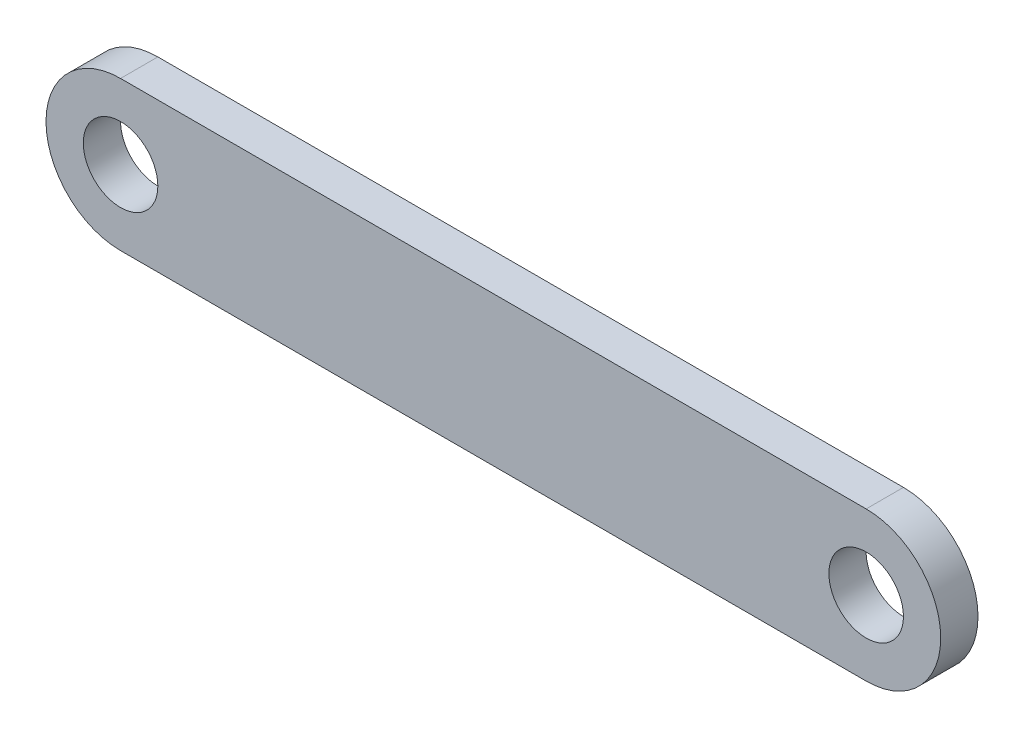
ISO-10303-21;
HEADER;
FILE_DESCRIPTION(('STEP AP214'),'2;1');
FILE_NAME('part.step','',(''),(''),'','','');
FILE_SCHEMA(('AUTOMOTIVE_DESIGN { 1 0 10303 214 1 1 1 1 }'));
ENDSEC;
DATA;
#1=APPLICATION_CONTEXT('core data for automotive mechanical design processes');
#2=APPLICATION_PROTOCOL_DEFINITION('international standard','automotive_design',2000,#1);
#3=PRODUCT_CONTEXT('',#1,'mechanical');
#4=PRODUCT('Part','Part','',(#3));
#5=PRODUCT_RELATED_PRODUCT_CATEGORY('part','',(#4));
#6=PRODUCT_DEFINITION_FORMATION('','',#4);
#7=PRODUCT_DEFINITION_CONTEXT('part definition',#1,'design');
#8=PRODUCT_DEFINITION('design','',#6,#7);
#9=PRODUCT_DEFINITION_SHAPE('','',#8);
#10=(LENGTH_UNIT() NAMED_UNIT(*) SI_UNIT(.MILLI.,.METRE.));
#11=(NAMED_UNIT(*) PLANE_ANGLE_UNIT() SI_UNIT($,.RADIAN.));
#12=(NAMED_UNIT(*) SI_UNIT($,.STERADIAN.) SOLID_ANGLE_UNIT());
#13=UNCERTAINTY_MEASURE_WITH_UNIT(LENGTH_MEASURE(1.E-05),#10,'distance_accuracy_value','');
#14=(GEOMETRIC_REPRESENTATION_CONTEXT(3) GLOBAL_UNCERTAINTY_ASSIGNED_CONTEXT((#13)) GLOBAL_UNIT_ASSIGNED_CONTEXT((#10,
#11,#12)) REPRESENTATION_CONTEXT('',''));
#15=CARTESIAN_POINT('',(0.,0.,0.));
#16=DIRECTION('',(0.,0.,1.));
#17=DIRECTION('',(1.,0.,0.));
#18=AXIS2_PLACEMENT_3D('',#15,#16,#17);
#19=CARTESIAN_POINT('',(50.,0.,5.));
#20=DIRECTION('',(0.,0.,1.));
#21=DIRECTION('',(1.,0.,0.));
#22=AXIS2_PLACEMENT_3D('',#19,#20,#21);
#23=PLANE('',#22);
#24=CARTESIAN_POINT('',(-50.,0.,5.));
#25=DIRECTION('',(0.,0.,1.));
#26=DIRECTION('',(1.,0.,0.));
#27=AXIS2_PLACEMENT_3D('',#24,#25,#26);
#28=CIRCLE('',#27,5.);
#29=CARTESIAN_POINT('',(-45.,0.,5.));
#30=VERTEX_POINT('',#29);
#31=EDGE_CURVE('E100',#30,#30,#28,.T.);
#32=ORIENTED_EDGE('',*,*,#31,.F.);
#33=EDGE_LOOP('',(#32));
#34=FACE_BOUND('',#33,.T.);
#35=CARTESIAN_POINT('',(50.,0.,5.));
#36=DIRECTION('',(0.,0.,1.));
#37=DIRECTION('',(1.,0.,0.));
#38=AXIS2_PLACEMENT_3D('',#35,#36,#37);
#39=CIRCLE('',#38,10.);
#40=CARTESIAN_POINT('',(50.,-9.99999999999997,5.));
#41=VERTEX_POINT('',#40);
#42=CARTESIAN_POINT('',(50.,10.,5.));
#43=VERTEX_POINT('',#42);
#44=EDGE_CURVE('E85',#41,#43,#39,.T.);
#45=ORIENTED_EDGE('',*,*,#44,.T.);
#46=DIRECTION('',(-1.,0.,0.));
#47=VECTOR('',#46,1.);
#48=CARTESIAN_POINT('',(50.,10.,5.));
#49=LINE('',#48,#47);
#50=CARTESIAN_POINT('',(-50.,10.,5.));
#51=VERTEX_POINT('',#50);
#52=EDGE_CURVE('E80',#43,#51,#49,.T.);
#53=ORIENTED_EDGE('',*,*,#52,.T.);
#54=CARTESIAN_POINT('',(-50.,0.,5.));
#55=DIRECTION('',(0.,0.,1.));
#56=DIRECTION('',(1.,0.,0.));
#57=AXIS2_PLACEMENT_3D('',#54,#55,#56);
#58=CIRCLE('',#57,10.);
#59=CARTESIAN_POINT('',(-50.,-9.99999999999998,5.));
#60=VERTEX_POINT('',#59);
#61=EDGE_CURVE('E83',#51,#60,#58,.T.);
#62=ORIENTED_EDGE('',*,*,#61,.T.);
#63=DIRECTION('',(1.,0.,0.));
#64=VECTOR('',#63,1.);
#65=CARTESIAN_POINT('',(50.,-9.99999999999997,5.));
#66=LINE('',#65,#64);
#67=EDGE_CURVE('E50',#60,#41,#66,.T.);
#68=ORIENTED_EDGE('',*,*,#67,.T.);
#69=EDGE_LOOP('',(#45,#53,#62,#68));
#70=FACE_BOUND('',#69,.T.);
#71=CARTESIAN_POINT('',(50.,0.,5.));
#72=DIRECTION('',(0.,0.,1.));
#73=DIRECTION('',(1.,0.,0.));
#74=AXIS2_PLACEMENT_3D('',#71,#72,#73);
#75=CIRCLE('',#74,5.);
#76=CARTESIAN_POINT('',(55.,0.,5.));
#77=VERTEX_POINT('',#76);
#78=EDGE_CURVE('E115',#77,#77,#75,.T.);
#79=ORIENTED_EDGE('',*,*,#78,.F.);
#80=EDGE_LOOP('',(#79));
#81=FACE_BOUND('',#80,.T.);
#82=ADVANCED_FACE('F33',(#34,#70,#81),#23,.T.);
#83=CARTESIAN_POINT('',(50.,0.,0.));
#84=DIRECTION('',(0.,0.,1.));
#85=DIRECTION('',(1.,0.,0.));
#86=AXIS2_PLACEMENT_3D('',#83,#84,#85);
#87=PLANE('',#86);
#88=CARTESIAN_POINT('',(50.,0.,0.));
#89=DIRECTION('',(0.,0.,1.));
#90=DIRECTION('',(1.,0.,0.));
#91=AXIS2_PLACEMENT_3D('',#88,#89,#90);
#92=CIRCLE('',#91,10.);
#93=CARTESIAN_POINT('',(50.,-9.99999999999997,0.));
#94=VERTEX_POINT('',#93);
#95=CARTESIAN_POINT('',(50.,10.,0.));
#96=VERTEX_POINT('',#95);
#97=EDGE_CURVE('E97',#94,#96,#92,.T.);
#98=ORIENTED_EDGE('',*,*,#97,.F.);
#99=DIRECTION('',(1.,0.,0.));
#100=VECTOR('',#99,1.);
#101=CARTESIAN_POINT('',(50.,-9.99999999999997,0.));
#102=LINE('',#101,#100);
#103=CARTESIAN_POINT('',(-50.,-9.99999999999998,0.));
#104=VERTEX_POINT('',#103);
#105=EDGE_CURVE('E73',#104,#94,#102,.T.);
#106=ORIENTED_EDGE('',*,*,#105,.F.);
#107=CARTESIAN_POINT('',(-50.,0.,0.));
#108=DIRECTION('',(0.,0.,1.));
#109=DIRECTION('',(1.,0.,0.));
#110=AXIS2_PLACEMENT_3D('',#107,#108,#109);
#111=CIRCLE('',#110,10.);
#112=CARTESIAN_POINT('',(-50.,10.,0.));
#113=VERTEX_POINT('',#112);
#114=EDGE_CURVE('E67',#113,#104,#111,.T.);
#115=ORIENTED_EDGE('',*,*,#114,.F.);
#116=DIRECTION('',(-1.,0.,0.));
#117=VECTOR('',#116,1.);
#118=CARTESIAN_POINT('',(50.,10.,0.));
#119=LINE('',#118,#117);
#120=EDGE_CURVE('E89',#96,#113,#119,.T.);
#121=ORIENTED_EDGE('',*,*,#120,.F.);
#122=EDGE_LOOP('',(#98,#106,#115,#121));
#123=FACE_BOUND('',#122,.T.);
#124=CARTESIAN_POINT('',(-50.,0.,0.));
#125=DIRECTION('',(0.,0.,1.));
#126=DIRECTION('',(1.,0.,0.));
#127=AXIS2_PLACEMENT_3D('',#124,#125,#126);
#128=CIRCLE('',#127,5.);
#129=CARTESIAN_POINT('',(-45.,0.,0.));
#130=VERTEX_POINT('',#129);
#131=EDGE_CURVE('E112',#130,#130,#128,.T.);
#132=ORIENTED_EDGE('',*,*,#131,.T.);
#133=EDGE_LOOP('',(#132));
#134=FACE_BOUND('',#133,.T.);
#135=CARTESIAN_POINT('',(50.,0.,0.));
#136=DIRECTION('',(0.,0.,1.));
#137=DIRECTION('',(1.,0.,0.));
#138=AXIS2_PLACEMENT_3D('',#135,#136,#137);
#139=CIRCLE('',#138,5.);
#140=CARTESIAN_POINT('',(55.,0.,0.));
#141=VERTEX_POINT('',#140);
#142=EDGE_CURVE('E118',#141,#141,#139,.T.);
#143=ORIENTED_EDGE('',*,*,#142,.T.);
#144=EDGE_LOOP('',(#143));
#145=FACE_BOUND('',#144,.T.);
#146=ADVANCED_FACE('F108',(#123,#134,#145),#87,.F.);
#147=CARTESIAN_POINT('',(50.,0.,5.));
#148=DIRECTION('',(0.,0.,-1.));
#149=DIRECTION('',(-1.,0.,0.));
#150=AXIS2_PLACEMENT_3D('',#147,#148,#149);
#151=CYLINDRICAL_SURFACE('',#150,10.);
#152=ORIENTED_EDGE('',*,*,#97,.T.);
#153=DIRECTION('',(0.,0.,-1.));
#154=VECTOR('',#153,1.);
#155=CARTESIAN_POINT('',(50.,10.,5.));
#156=LINE('',#155,#154);
#157=EDGE_CURVE('E11',#43,#96,#156,.T.);
#158=ORIENTED_EDGE('',*,*,#157,.F.);
#159=ORIENTED_EDGE('',*,*,#44,.F.);
#160=DIRECTION('',(0.,0.,-1.));
#161=VECTOR('',#160,1.);
#162=CARTESIAN_POINT('',(50.,-9.99999999999997,5.));
#163=LINE('',#162,#161);
#164=EDGE_CURVE('E93',#41,#94,#163,.T.);
#165=ORIENTED_EDGE('',*,*,#164,.T.);
#166=EDGE_LOOP('',(#152,#158,#159,#165));
#167=FACE_BOUND('',#166,.T.);
#168=ADVANCED_FACE('F35',(#167),#151,.T.);
#169=CARTESIAN_POINT('',(50.,10.,5.));
#170=DIRECTION('',(0.,-1.,0.));
#171=DIRECTION('',(1.,0.,0.));
#172=AXIS2_PLACEMENT_3D('',#169,#170,#171);
#173=PLANE('',#172);
#174=ORIENTED_EDGE('',*,*,#120,.T.);
#175=DIRECTION('',(0.,0.,-1.));
#176=VECTOR('',#175,1.);
#177=CARTESIAN_POINT('',(-50.,10.,5.));
#178=LINE('',#177,#176);
#179=EDGE_CURVE('E42',#51,#113,#178,.T.);
#180=ORIENTED_EDGE('',*,*,#179,.F.);
#181=ORIENTED_EDGE('',*,*,#52,.F.);
#182=ORIENTED_EDGE('',*,*,#157,.T.);
#183=EDGE_LOOP('',(#174,#180,#181,#182));
#184=FACE_BOUND('',#183,.T.);
#185=ADVANCED_FACE('F88',(#184),#173,.F.);
#186=CARTESIAN_POINT('',(-50.,0.,5.));
#187=DIRECTION('',(0.,0.,-1.));
#188=DIRECTION('',(-1.,0.,0.));
#189=AXIS2_PLACEMENT_3D('',#186,#187,#188);
#190=CYLINDRICAL_SURFACE('',#189,10.);
#191=ORIENTED_EDGE('',*,*,#114,.T.);
#192=DIRECTION('',(0.,0.,-1.));
#193=VECTOR('',#192,1.);
#194=CARTESIAN_POINT('',(-50.,-9.99999999999998,5.));
#195=LINE('',#194,#193);
#196=EDGE_CURVE('E90',#60,#104,#195,.T.);
#197=ORIENTED_EDGE('',*,*,#196,.F.);
#198=ORIENTED_EDGE('',*,*,#61,.F.);
#199=ORIENTED_EDGE('',*,*,#179,.T.);
#200=EDGE_LOOP('',(#191,#197,#198,#199));
#201=FACE_BOUND('',#200,.T.);
#202=ADVANCED_FACE('F91',(#201),#190,.T.);
#203=CARTESIAN_POINT('',(50.,-9.99999999999997,5.));
#204=DIRECTION('',(0.,1.,0.));
#205=DIRECTION('',(-1.,0.,0.));
#206=AXIS2_PLACEMENT_3D('',#203,#204,#205);
#207=PLANE('',#206);
#208=ORIENTED_EDGE('',*,*,#105,.T.);
#209=ORIENTED_EDGE('',*,*,#164,.F.);
#210=ORIENTED_EDGE('',*,*,#67,.F.);
#211=ORIENTED_EDGE('',*,*,#196,.T.);
#212=EDGE_LOOP('',(#208,#209,#210,#211));
#213=FACE_BOUND('',#212,.T.);
#214=ADVANCED_FACE('F105',(#213),#207,.F.);
#215=CARTESIAN_POINT('',(-50.,0.,5.));
#216=DIRECTION('',(0.,0.,-1.));
#217=DIRECTION('',(-1.,0.,0.));
#218=AXIS2_PLACEMENT_3D('',#215,#216,#217);
#219=CYLINDRICAL_SURFACE('',#218,5.);
#220=ORIENTED_EDGE('',*,*,#31,.T.);
#221=EDGE_LOOP('',(#220));
#222=FACE_BOUND('',#221,.T.);
#223=ORIENTED_EDGE('',*,*,#131,.F.);
#224=EDGE_LOOP('',(#223));
#225=FACE_BOUND('',#224,.T.);
#226=ADVANCED_FACE('F135',(#222,#225),#219,.F.);
#227=CARTESIAN_POINT('',(50.,0.,5.));
#228=DIRECTION('',(0.,0.,-1.));
#229=DIRECTION('',(-1.,0.,0.));
#230=AXIS2_PLACEMENT_3D('',#227,#228,#229);
#231=CYLINDRICAL_SURFACE('',#230,5.);
#232=ORIENTED_EDGE('',*,*,#78,.T.);
#233=EDGE_LOOP('',(#232));
#234=FACE_BOUND('',#233,.T.);
#235=ORIENTED_EDGE('',*,*,#142,.F.);
#236=EDGE_LOOP('',(#235));
#237=FACE_BOUND('',#236,.T.);
#238=ADVANCED_FACE('F124',(#234,#237),#231,.F.);
#239=CLOSED_SHELL('',(#82,#146,#168,#185,#202,#214,#226,#238));
#240=MANIFOLD_SOLID_BREP('B2',#239);
#241=ADVANCED_BREP_SHAPE_REPRESENTATION('',(#18,#240),#14);
#242=SHAPE_DEFINITION_REPRESENTATION(#9,#241);
ENDSEC;
END-ISO-10303-21;
